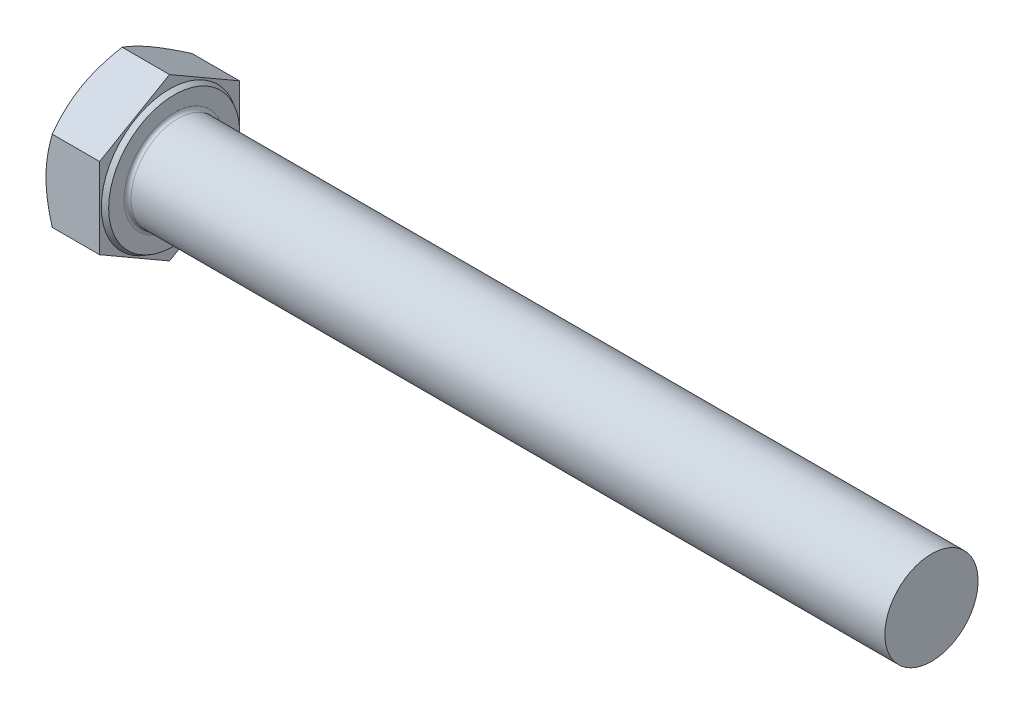
ISO-10303-21;
HEADER;
FILE_DESCRIPTION(('STEP AP214'),'2;1');
FILE_NAME('part.step','',(''),(''),'','','');
FILE_SCHEMA(('AUTOMOTIVE_DESIGN { 1 0 10303 214 1 1 1 1 }'));
ENDSEC;
DATA;
#1=APPLICATION_CONTEXT('core data for automotive mechanical design processes');
#2=APPLICATION_PROTOCOL_DEFINITION('international standard','automotive_design',2000,#1);
#3=PRODUCT_CONTEXT('',#1,'mechanical');
#4=PRODUCT('Part','Part','',(#3));
#5=PRODUCT_RELATED_PRODUCT_CATEGORY('part','',(#4));
#6=PRODUCT_DEFINITION_FORMATION('','',#4);
#7=PRODUCT_DEFINITION_CONTEXT('part definition',#1,'design');
#8=PRODUCT_DEFINITION('design','',#6,#7);
#9=PRODUCT_DEFINITION_SHAPE('','',#8);
#10=(LENGTH_UNIT() NAMED_UNIT(*) SI_UNIT(.MILLI.,.METRE.));
#11=(NAMED_UNIT(*) PLANE_ANGLE_UNIT() SI_UNIT($,.RADIAN.));
#12=(NAMED_UNIT(*) SI_UNIT($,.STERADIAN.) SOLID_ANGLE_UNIT());
#13=UNCERTAINTY_MEASURE_WITH_UNIT(LENGTH_MEASURE(1.E-05),#10,'distance_accuracy_value','');
#14=(GEOMETRIC_REPRESENTATION_CONTEXT(3) GLOBAL_UNCERTAINTY_ASSIGNED_CONTEXT((#13)) GLOBAL_UNIT_ASSIGNED_CONTEXT((#10,
#11,#12)) REPRESENTATION_CONTEXT('',''));
#15=CARTESIAN_POINT('',(0.,0.,0.));
#16=DIRECTION('',(0.,0.,1.));
#17=DIRECTION('',(1.,0.,0.));
#18=AXIS2_PLACEMENT_3D('',#15,#16,#17);
#19=CARTESIAN_POINT('',(10.,6.9282032302755,-12.));
#20=DIRECTION('',(0.,-0.866025403784438,0.500000000000001));
#21=DIRECTION('',(0.,-0.500000000000001,-0.866025403784438));
#22=AXIS2_PLACEMENT_3D('',#19,#20,#21);
#23=PLANE('',#22);
#24=DIRECTION('',(0.,0.500000000000001,0.866025403784438));
#25=VECTOR('',#24,1.);
#26=CARTESIAN_POINT('',(9.2,6.9282032302755,-12.));
#27=LINE('',#26,#25);
#28=CARTESIAN_POINT('',(9.2,6.92820323027553,-12.));
#29=VERTEX_POINT('',#28);
#30=CARTESIAN_POINT('',(9.2,13.856406460551,0.));
#31=VERTEX_POINT('',#30);
#32=EDGE_CURVE('E117',#29,#31,#27,.T.);
#33=ORIENTED_EDGE('',*,*,#32,.F.);
#34=DIRECTION('',(-1.,0.,0.));
#35=VECTOR('',#34,1.);
#36=CARTESIAN_POINT('',(10.,6.9282032302755,-12.));
#37=LINE('',#36,#35);
#38=CARTESIAN_POINT('',(1.07179676972448,6.9282032302755,-12.));
#39=VERTEX_POINT('',#38);
#40=EDGE_CURVE('E265',#29,#39,#37,.T.);
#41=ORIENTED_EDGE('',*,*,#40,.T.);
#42=CARTESIAN_POINT('',(1.07186343722448,13.8565219306049,0.000199999999999553));
#43=CARTESIAN_POINT('',(0.983949632185867,13.7042251307133,-0.263585795242262));
#44=CARTESIAN_POINT('',(0.900025997556673,13.5513604901482,-0.5283551193818));
#45=CARTESIAN_POINT('',(0.741266218872847,13.244405350712,-1.06001701652966));
#46=CARTESIAN_POINT('',(0.666433063673588,13.0903144663124,-1.32691025729307));
#47=CARTESIAN_POINT('',(0.457017539854156,12.6255589607763,-2.13189040597901));
#48=CARTESIAN_POINT('',(0.337903236722854,12.3130596590925,-2.6731550738251));
#49=CARTESIAN_POINT('',(0.198231061003147,11.8454187840152,-3.483132829155));
#50=CARTESIAN_POINT('',(0.158443797040446,11.6916742921315,-3.74942610048137));
#51=CARTESIAN_POINT('',(0.0917233692170917,11.3834734611381,-4.28324559869684));
#52=CARTESIAN_POINT('',(0.064790452767776,11.2290171083848,-4.55077184921738));
#53=CARTESIAN_POINT('',(0.0244685919169266,10.9198468953819,-5.08627036632535));
#54=CARTESIAN_POINT('',(0.0110635528823191,10.7651335610083,-5.35424172206873));
#55=CARTESIAN_POINT('',(-0.00191690624283182,10.4555635369292,-5.89043273227404));
#56=CARTESIAN_POINT('',(-0.00149275363726502,10.3007068518009,-6.15865237880804));
#57=CARTESIAN_POINT('',(0.0122200193427726,10.011202064883,-6.6600893787841));
#58=CARTESIAN_POINT('',(0.0238359825785306,9.87653331649855,-6.89334249317776));
#59=CARTESIAN_POINT('',(0.0573080088723786,9.60750555673725,-7.35931224173077));
#60=CARTESIAN_POINT('',(0.0791647962662195,9.47314656794543,-7.59202883677177));
#61=CARTESIAN_POINT('',(0.132737416542911,9.20481134519089,-8.05679907604294));
#62=CARTESIAN_POINT('',(0.164461392492925,9.07083551994084,-8.288852012362));
#63=CARTESIAN_POINT('',(0.237211775670441,8.80351197901489,-8.75186996730498));
#64=CARTESIAN_POINT('',(0.278238815183198,8.67016430666066,-8.98283491089354));
#65=CARTESIAN_POINT('',(0.416311653281803,8.2653799638421,-9.68394195876367));
#66=CARTESIAN_POINT('',(0.527124888339326,7.99511549730955,-10.1520537462785));
#67=CARTESIAN_POINT('',(0.778625766937884,7.45861659251288,-11.0812971075914));
#68=CARTESIAN_POINT('',(0.919254342659384,7.19237528499142,-11.5424405792922));
#69=CARTESIAN_POINT('',(1.07186343722448,6.92808776022166,-12.0002));
#70=B_SPLINE_CURVE_WITH_KNOTS('',3,(#42,#43,#44,#45,#46,#47,#48,#49,#50,#51,#52,#53,#54,#55,#56,
#57,#58,#59,#60,#61,#62,#63,#64,#65,#66,#67,#68,#69),.UNSPECIFIED.,.F.,.F.,(4,2,2,2,2,2,2,2,2,2,
2,2,2,4),(0.,0.951004872251246,1.90232158356438,3.80900466161369,4.7389455141357,
5.6689042647761,6.59775529889866,7.52657763276931,8.33514643820579,9.1437724425275,
9.95306755799766,10.7624176939264,12.4167102786892,14.0677556316691),.UNSPECIFIED.);
#71=CARTESIAN_POINT('',(0.,10.3923048454133,-6.00000000000001));
#72=VERTEX_POINT('',#71);
#73=EDGE_CURVE('E173',#72,#39,#70,.T.);
#74=ORIENTED_EDGE('',*,*,#73,.F.);
#75=CARTESIAN_POINT('',(1.07179676972449,13.856406460551,0.));
#76=VERTEX_POINT('',#75);
#77=EDGE_CURVE('E63',#76,#72,#70,.T.);
#78=ORIENTED_EDGE('',*,*,#77,.F.);
#79=DIRECTION('',(-1.,0.,0.));
#80=VECTOR('',#79,1.);
#81=CARTESIAN_POINT('',(10.,13.856406460551,0.));
#82=LINE('',#81,#80);
#83=EDGE_CURVE('E136',#31,#76,#82,.T.);
#84=ORIENTED_EDGE('',*,*,#83,.F.);
#85=EDGE_LOOP('',(#33,#41,#74,#78,#84));
#86=FACE_BOUND('',#85,.T.);
#87=ADVANCED_FACE('F40',(#86),#23,.F.);
#88=CARTESIAN_POINT('',(10.,13.856406460551,0.));
#89=DIRECTION('',(0.,-0.866025403784438,-0.500000000000001));
#90=DIRECTION('',(0.,0.500000000000001,-0.866025403784438));
#91=AXIS2_PLACEMENT_3D('',#88,#89,#90);
#92=PLANE('',#91);
#93=DIRECTION('',(0.,-0.500000000000001,0.866025403784438));
#94=VECTOR('',#93,1.);
#95=CARTESIAN_POINT('',(9.2,13.856406460551,0.));
#96=LINE('',#95,#94);
#97=CARTESIAN_POINT('',(9.2,6.92820323027553,12.));
#98=VERTEX_POINT('',#97);
#99=EDGE_CURVE('E111',#31,#98,#96,.T.);
#100=ORIENTED_EDGE('',*,*,#99,.F.);
#101=ORIENTED_EDGE('',*,*,#83,.T.);
#102=CARTESIAN_POINT('',(1.07186343722448,6.92808776022167,12.0002));
#103=CARTESIAN_POINT('',(0.983949632185859,7.08038456011319,11.7364142047577));
#104=CARTESIAN_POINT('',(0.900025997556666,7.2332492006783,11.4716448806182));
#105=CARTESIAN_POINT('',(0.74126621887284,7.54020434011449,10.9399829834703));
#106=CARTESIAN_POINT('',(0.666433063673582,7.69429522451413,10.6730897427069));
#107=CARTESIAN_POINT('',(0.457017539854152,8.15905073005027,9.86810959402099));
#108=CARTESIAN_POINT('',(0.33790323672285,8.47155003173404,9.3268449261749));
#109=CARTESIAN_POINT('',(0.198231061003145,8.93919090681137,8.51686717084501));
#110=CARTESIAN_POINT('',(0.158443797040445,9.09293539869504,8.25057389951863));
#111=CARTESIAN_POINT('',(0.0917233692170918,9.40113622968841,7.71675440130317));
#112=CARTESIAN_POINT('',(0.0647904527677764,9.55559258244173,7.44922815078262));
#113=CARTESIAN_POINT('',(0.0244685919169272,9.86476279544467,6.91372963367465));
#114=CARTESIAN_POINT('',(0.0110635528823195,10.0194761298182,6.64575827793128));
#115=CARTESIAN_POINT('',(-0.00191690624283124,10.3290461538973,6.10956726772597));
#116=CARTESIAN_POINT('',(-0.00149275363726407,10.4839028390257,5.84134762119197));
#117=CARTESIAN_POINT('',(0.0122200193427746,10.7734076259435,5.3399106212159));
#118=CARTESIAN_POINT('',(0.0238359825785332,10.908076374328,5.10665750682225));
#119=CARTESIAN_POINT('',(0.0573080088723814,11.1771041340893,4.64068775826924));
#120=CARTESIAN_POINT('',(0.0791647962662217,11.3114631228811,4.40797116322823));
#121=CARTESIAN_POINT('',(0.132737416542914,11.5797983456356,3.94320092395706));
#122=CARTESIAN_POINT('',(0.164461392492929,11.7137741708857,3.711147987638));
#123=CARTESIAN_POINT('',(0.237211775670446,11.9810977118116,3.24813003269502));
#124=CARTESIAN_POINT('',(0.278238815183203,12.1144453841659,3.01716508910646));
#125=CARTESIAN_POINT('',(0.416311653281808,12.5192297269844,2.31605804123633));
#126=CARTESIAN_POINT('',(0.527124888339332,12.789494193517,1.84794625372147));
#127=CARTESIAN_POINT('',(0.778625766937891,13.3259930983136,0.918702892408579));
#128=CARTESIAN_POINT('',(0.919254342659392,13.5922344058351,0.457559420707846));
#129=CARTESIAN_POINT('',(1.07186343722448,13.8565219306049,-0.000200000000000272));
#130=B_SPLINE_CURVE_WITH_KNOTS('',3,(#102,#103,#104,#105,#106,#107,#108,#109,#110,#111,#112,
#113,#114,#115,#116,#117,#118,#119,#120,#121,#122,#123,#124,#125,#126,#127,#128,#129),
.UNSPECIFIED.,.F.,.F.,(4,2,2,2,2,2,2,2,2,2,2,2,2,4),(0.,0.951004872251244,1.90232158356437,
3.80900466161369,4.7389455141357,5.66890426477609,6.59775529889865,7.5265776327693,
8.33514643820579,9.14377244252749,9.95306755799765,10.7624176939264,12.4167102786892,
14.0677556316691),.UNSPECIFIED.);
#131=CARTESIAN_POINT('',(0.,10.3923048454133,6.00000000000001));
#132=VERTEX_POINT('',#131);
#133=EDGE_CURVE('E221',#132,#76,#130,.T.);
#134=ORIENTED_EDGE('',*,*,#133,.F.);
#135=CARTESIAN_POINT('',(1.07179676972448,6.9282032302755,12.));
#136=VERTEX_POINT('',#135);
#137=EDGE_CURVE('E135',#136,#132,#130,.T.);
#138=ORIENTED_EDGE('',*,*,#137,.F.);
#139=DIRECTION('',(-1.,0.,0.));
#140=VECTOR('',#139,1.);
#141=CARTESIAN_POINT('',(10.,6.9282032302755,12.));
#142=LINE('',#141,#140);
#143=EDGE_CURVE('E126',#98,#136,#142,.T.);
#144=ORIENTED_EDGE('',*,*,#143,.F.);
#145=EDGE_LOOP('',(#100,#101,#134,#138,#144));
#146=FACE_BOUND('',#145,.T.);
#147=ADVANCED_FACE('F133',(#146),#92,.F.);
#148=CARTESIAN_POINT('',(10.,6.9282032302755,12.));
#149=DIRECTION('',(0.,0.,-1.));
#150=DIRECTION('',(-1.,0.,0.));
#151=AXIS2_PLACEMENT_3D('',#148,#149,#150);
#152=PLANE('',#151);
#153=DIRECTION('',(0.,-1.,0.));
#154=VECTOR('',#153,1.);
#155=CARTESIAN_POINT('',(9.2,6.9282032302755,12.));
#156=LINE('',#155,#154);
#157=CARTESIAN_POINT('',(9.2,-6.92820323027552,12.));
#158=VERTEX_POINT('',#157);
#159=EDGE_CURVE('E114',#98,#158,#156,.T.);
#160=ORIENTED_EDGE('',*,*,#159,.F.);
#161=ORIENTED_EDGE('',*,*,#143,.T.);
#162=CARTESIAN_POINT('',(5.9379652249916,-18.7780422876809,12.));
#163=CARTESIAN_POINT('',(5.81013580153171,-18.5152821742341,12.));
#164=CARTESIAN_POINT('',(5.68293119845564,-18.2522182359297,12.));
#165=CARTESIAN_POINT('',(5.42991281410037,-17.7254193681017,12.));
#166=CARTESIAN_POINT('',(5.30409904630056,-17.4616844321055,12.));
#167=CARTESIAN_POINT('',(4.92892368290875,-16.6693101743882,12.));
#168=CARTESIAN_POINT('',(4.68186469152994,-16.1395765656331,12.));
#169=CARTESIAN_POINT('',(4.19405479952982,-15.0738169190078,12.));
#170=CARTESIAN_POINT('',(3.95334413341026,-14.5377724221017,12.));
#171=CARTESIAN_POINT('',(3.48154718674623,-13.461479060208,12.));
#172=CARTESIAN_POINT('',(3.25046046260965,-12.9212303903669,12.));
#173=CARTESIAN_POINT('',(2.79294900667128,-11.8175688689819,12.));
#174=CARTESIAN_POINT('',(2.56693655895501,-11.2539842320577,12.));
#175=CARTESIAN_POINT('',(2.13161283273163,-10.1202797331247,12.));
#176=CARTESIAN_POINT('',(1.92230340506571,-9.55015915485906,12.));
#177=CARTESIAN_POINT('',(1.52576124918553,-8.40350794466347,12.));
#178=CARTESIAN_POINT('',(1.33848523718245,-7.82699240007888,12.));
#179=CARTESIAN_POINT('',(0.991896700180059,-6.66563869600162,12.));
#180=CARTESIAN_POINT('',(0.832575542892165,-6.08080316618919,12.));
#181=CARTESIAN_POINT('',(0.620681197025571,-5.19882791551971,12.));
#182=CARTESIAN_POINT('',(0.554713150855291,-4.90488790342147,12.));
#183=CARTESIAN_POINT('',(0.432574422995982,-4.31496880701143,12.));
#184=CARTESIAN_POINT('',(0.376403548449441,-4.01898976295725,12.));
#185=CARTESIAN_POINT('',(0.27484004416511,-3.42518449183526,12.));
#186=CARTESIAN_POINT('',(0.229447213467065,-3.12735829931441,12.));
#187=CARTESIAN_POINT('',(0.150338666864214,-2.53016033534833,12.));
#188=CARTESIAN_POINT('',(0.116622484244829,-2.23078862616279,12.));
#189=CARTESIAN_POINT('',(0.0619693201283227,-1.63489952034464,12.));
#190=CARTESIAN_POINT('',(0.0408679219512437,-1.33839729705375,12.));
#191=CARTESIAN_POINT('',(0.0112310519021946,-0.744766224338129,12.));
#192=CARTESIAN_POINT('',(0.00269536679662733,-0.447637385632426,12.));
#193=CARTESIAN_POINT('',(-0.00160621157202336,0.146715096942924,12.));
#194=CARTESIAN_POINT('',(0.00262788821472192,0.443938740760884,12.));
#195=CARTESIAN_POINT('',(0.0237602868313374,1.03793867900076,12.));
#196=CARTESIAN_POINT('',(0.0406591751133799,1.33471495195666,12.));
#197=CARTESIAN_POINT('',(0.0957363037225936,2.04293812544911,12.));
#198=CARTESIAN_POINT('',(0.139644388869434,2.45394931182504,12.));
#199=CARTESIAN_POINT('',(0.249393763135934,3.27301119833394,12.));
#200=CARTESIAN_POINT('',(0.315237895547363,3.68106150767658,12.));
#201=CARTESIAN_POINT('',(0.542190666924391,4.90025554060104,12.));
#202=CARTESIAN_POINT('',(0.732681274216203,5.70600726238708,12.));
#203=CARTESIAN_POINT('',(1.06415793334627,6.91101760118603,12.));
#204=CARTESIAN_POINT('',(1.18384338751807,7.31649624625233,12.));
#205=CARTESIAN_POINT('',(1.43593551476422,8.1235184018115,12.));
#206=CARTESIAN_POINT('',(1.56834227450981,8.52506188547325,12.));
#207=CARTESIAN_POINT('',(1.8437286581276,9.32433402651663,12.));
#208=CARTESIAN_POINT('',(1.9867050037192,9.72206382387893,12.));
#209=CARTESIAN_POINT('',(2.28151949374364,10.5142091061849,12.));
#210=CARTESIAN_POINT('',(2.4333575167401,10.908624636461,12.));
#211=CARTESIAN_POINT('',(2.81137815071346,11.8636440545741,12.));
#212=CARTESIAN_POINT('',(3.04143185567875,12.4227131308577,12.));
#213=CARTESIAN_POINT('',(3.51333410611205,13.5358669332653,12.));
#214=CARTESIAN_POINT('',(3.75518348678292,14.0899513031431,12.));
#215=CARTESIAN_POINT('',(4.24823475653156,15.1941025186566,12.));
#216=CARTESIAN_POINT('',(4.49943904043688,15.7441682918315,12.));
#217=CARTESIAN_POINT('',(5.00924552887371,16.8408349536019,12.));
#218=CARTESIAN_POINT('',(5.26784754956297,17.3874359278899,12.));
#219=CARTESIAN_POINT('',(5.7913387992848,18.4784293923002,12.));
#220=CARTESIAN_POINT('',(6.0562352746522,19.0228183989982,12.));
#221=CARTESIAN_POINT('',(6.59090796254076,20.1091945794083,12.));
#222=CARTESIAN_POINT('',(6.86068419945744,20.6511817410959,12.));
#223=CARTESIAN_POINT('',(7.40421496208664,21.7330545936328,12.));
#224=CARTESIAN_POINT('',(7.67796889125698,22.2729405845111,12.));
#225=CARTESIAN_POINT('',(8.22882461462082,23.3510028742049,12.));
#226=CARTESIAN_POINT('',(8.50592642242827,23.8891791660568,12.));
#227=CARTESIAN_POINT('',(9.29226596146123,25.4066579940567,12.));
#228=CARTESIAN_POINT('',(9.80475659623532,26.3842748096138,12.));
#229=CARTESIAN_POINT('',(10.8366490575024,28.3358962609434,12.));
#230=CARTESIAN_POINT('',(11.3560511647271,29.3099007479222,12.));
#231=CARTESIAN_POINT('',(12.3986980712295,31.2524398572292,12.));
#232=CARTESIAN_POINT('',(12.9219285874182,32.2209821512087,12.));
#233=CARTESIAN_POINT('',(13.709817261168,33.6721037842397,12.));
#234=CARTESIAN_POINT('',(13.9729461083086,34.1555146940213,12.));
#235=CARTESIAN_POINT('',(14.5001155834576,35.1218381868036,12.));
#236=CARTESIAN_POINT('',(14.7641562100751,35.6047507705631,12.));
#237=CARTESIAN_POINT('',(15.0285993289473,36.0874429112689,12.));
#238=B_SPLINE_CURVE_WITH_KNOTS('',3,(#162,#163,#164,#165,#166,#167,#168,#169,#170,#171,#172,
#173,#174,#175,#176,#177,#178,#179,#180,#181,#182,#183,#184,#185,#186,#187,#188,#189,#190,#191,
#192,#193,#194,#195,#196,#197,#198,#199,#200,#201,#202,#203,#204,#205,#206,#207,#208,#209,#210,
#211,#212,#213,#214,#215,#216,#217,#218,#219,#220,#221,#222,#223,#224,#225,#226,#227,#228,#229,
#230,#231,#232,#233,#234,#235,#236,#237),.UNSPECIFIED.,.F.,.F.,(4,2,2,2,2,2,2,2,2,2,2,2,2,2,2,2,
2,2,2,2,2,2,2,2,2,2,2,2,2,2,2,2,2,2,2,2,2,4),(0.,0.876610778943413,1.75323004620523,
3.50671945197807,5.26947518067905,7.03214956933034,8.85359042595666,10.6752328347611,
12.4932347351832,14.3106742559303,15.2142921518806,16.117892258087,17.0214755150421,
17.9250226516858,18.816520871687,19.7080039632539,20.5994865696161,21.4910106704728,
22.7303633484055,23.9698767304575,26.4502079763428,27.7184187234137,28.9866381115161,
30.2544657836991,31.5222760862275,33.3357454112635,35.1493433274816,36.9634087547281,
38.7774291394606,40.5936500751824,42.4098800933003,44.2258404831105,46.0418082599001,
49.3531754129826,52.664677481008,55.9671781132062,57.6183303465534,59.2694800621134),.UNSPECIFIED.);
#239=CARTESIAN_POINT('',(0.,0.,12.));
#240=VERTEX_POINT('',#239);
#241=EDGE_CURVE('E226',#240,#136,#238,.T.);
#242=ORIENTED_EDGE('',*,*,#241,.F.);
#243=CARTESIAN_POINT('',(1.07179676972449,-6.92820323027552,12.));
#244=VERTEX_POINT('',#243);
#245=EDGE_CURVE('E232',#244,#240,#238,.T.);
#246=ORIENTED_EDGE('',*,*,#245,.F.);
#247=DIRECTION('',(-1.,0.,0.));
#248=VECTOR('',#247,1.);
#249=CARTESIAN_POINT('',(10.,-6.92820323027552,12.));
#250=LINE('',#249,#248);
#251=EDGE_CURVE('E129',#158,#244,#250,.T.);
#252=ORIENTED_EDGE('',*,*,#251,.F.);
#253=EDGE_LOOP('',(#160,#161,#242,#246,#252));
#254=FACE_BOUND('',#253,.T.);
#255=ADVANCED_FACE('F124',(#254),#152,.F.);
#256=CARTESIAN_POINT('',(10.,-13.856406460551,0.));
#257=DIRECTION('',(0.,0.866025403784438,-0.500000000000001));
#258=DIRECTION('',(0.,0.500000000000001,0.866025403784438));
#259=AXIS2_PLACEMENT_3D('',#256,#257,#258);
#260=PLANE('',#259);
#261=DIRECTION('',(0.,-0.500000000000001,-0.866025403784438));
#262=VECTOR('',#261,1.);
#263=CARTESIAN_POINT('',(9.2,-13.856406460551,0.));
#264=LINE('',#263,#262);
#265=CARTESIAN_POINT('',(9.2,-13.856406460551,0.));
#266=VERTEX_POINT('',#265);
#267=EDGE_CURVE('E130',#158,#266,#264,.T.);
#268=ORIENTED_EDGE('',*,*,#267,.F.);
#269=ORIENTED_EDGE('',*,*,#251,.T.);
#270=CARTESIAN_POINT('',(1.0718634372245,-13.8565219306049,-0.000200000000000002));
#271=CARTESIAN_POINT('',(0.983949632185878,-13.7042251307134,0.263585795242263));
#272=CARTESIAN_POINT('',(0.900025997556684,-13.5513604901482,0.528355119381801));
#273=CARTESIAN_POINT('',(0.741266218872858,-13.2444053507121,1.06001701652966));
#274=CARTESIAN_POINT('',(0.6664330636736,-13.0903144663124,1.32691025729307));
#275=CARTESIAN_POINT('',(0.457017539854168,-12.6255589607763,2.13189040597901));
#276=CARTESIAN_POINT('',(0.337903236722866,-12.3130596590925,2.6731550738251));
#277=CARTESIAN_POINT('',(0.198231061003159,-11.8454187840152,3.483132829155));
#278=CARTESIAN_POINT('',(0.158443797040458,-11.6916742921315,3.74942610048138));
#279=CARTESIAN_POINT('',(0.0917233692171037,-11.3834734611381,4.28324559869685));
#280=CARTESIAN_POINT('',(0.0647904527677882,-11.2290171083848,4.55077184921739));
#281=CARTESIAN_POINT('',(0.0244685919169384,-10.9198468953819,5.08627036632536));
#282=CARTESIAN_POINT('',(0.0110635528823302,-10.7651335610083,5.35424172206874));
#283=CARTESIAN_POINT('',(-0.00191690624282097,-10.4555635369292,5.89043273227405));
#284=CARTESIAN_POINT('',(-0.00149275363725383,-10.3007068518009,6.15865237880805));
#285=CARTESIAN_POINT('',(0.0122200193427844,-10.0112020648831,6.66008937878412));
#286=CARTESIAN_POINT('',(0.0238359825785426,-9.87653331649857,6.89334249317777));
#287=CARTESIAN_POINT('',(0.0573080088723901,-9.60750555673727,7.35931224173078));
#288=CARTESIAN_POINT('',(0.0791647962662302,-9.47314656794545,7.59202883677178));
#289=CARTESIAN_POINT('',(0.132737416542921,-9.20481134519091,8.05679907604295));
#290=CARTESIAN_POINT('',(0.164461392492935,-9.07083551994086,8.28885201236201));
#291=CARTESIAN_POINT('',(0.237211775670452,-8.8035119790149,8.75186996730499));
#292=CARTESIAN_POINT('',(0.278238815183209,-8.67016430666068,8.98283491089355));
#293=CARTESIAN_POINT('',(0.416311653281814,-8.26537996384211,9.68394195876367));
#294=CARTESIAN_POINT('',(0.527124888339336,-7.99511549730957,10.1520537462785));
#295=CARTESIAN_POINT('',(0.778625766937892,-7.4586165925129,11.0812971075914));
#296=CARTESIAN_POINT('',(0.91925434265939,-7.19237528499145,11.5424405792922));
#297=CARTESIAN_POINT('',(1.07186343722448,-6.92808776022168,12.0002));
#298=B_SPLINE_CURVE_WITH_KNOTS('',3,(#270,#271,#272,#273,#274,#275,#276,#277,#278,#279,#280,
#281,#282,#283,#284,#285,#286,#287,#288,#289,#290,#291,#292,#293,#294,#295,#296,#297),
.UNSPECIFIED.,.F.,.F.,(4,2,2,2,2,2,2,2,2,2,2,2,2,4),(0.,0.951004872251247,1.90232158356438,
3.80900466161369,4.73894551413571,5.66890426477611,6.59775529889867,7.52657763276932,
8.3351464382058,9.14377244252751,9.95306755799767,10.7624176939264,12.4167102786892,
14.0677556316691),.UNSPECIFIED.);
#299=CARTESIAN_POINT('',(0.,-10.3923048454133,6.00000000000001));
#300=VERTEX_POINT('',#299);
#301=EDGE_CURVE('E233',#300,#244,#298,.T.);
#302=ORIENTED_EDGE('',*,*,#301,.F.);
#303=CARTESIAN_POINT('',(1.0717967697245,-13.856406460551,0.));
#304=VERTEX_POINT('',#303);
#305=EDGE_CURVE('E189',#304,#300,#298,.T.);
#306=ORIENTED_EDGE('',*,*,#305,.F.);
#307=DIRECTION('',(-1.,0.,0.));
#308=VECTOR('',#307,1.);
#309=CARTESIAN_POINT('',(10.,-13.856406460551,0.));
#310=LINE('',#309,#308);
#311=EDGE_CURVE('E140',#266,#304,#310,.T.);
#312=ORIENTED_EDGE('',*,*,#311,.F.);
#313=EDGE_LOOP('',(#268,#269,#302,#306,#312));
#314=FACE_BOUND('',#313,.T.);
#315=ADVANCED_FACE('F238',(#314),#260,.F.);
#316=CARTESIAN_POINT('',(10.,-6.92820323027553,-12.));
#317=DIRECTION('',(0.,0.866025403784438,0.500000000000001));
#318=DIRECTION('',(0.,-0.500000000000001,0.866025403784438));
#319=AXIS2_PLACEMENT_3D('',#316,#317,#318);
#320=PLANE('',#319);
#321=DIRECTION('',(0.,0.500000000000001,-0.866025403784438));
#322=VECTOR('',#321,1.);
#323=CARTESIAN_POINT('',(9.2,-6.92820323027553,-12.));
#324=LINE('',#323,#322);
#325=CARTESIAN_POINT('',(9.2,-6.92820323027553,-12.));
#326=VERTEX_POINT('',#325);
#327=EDGE_CURVE('E55',#266,#326,#324,.T.);
#328=ORIENTED_EDGE('',*,*,#327,.F.);
#329=ORIENTED_EDGE('',*,*,#311,.T.);
#330=CARTESIAN_POINT('',(1.07186343722449,-6.92808776022169,-12.0002));
#331=CARTESIAN_POINT('',(0.983949632185869,-7.08038456011321,-11.7364142047577));
#332=CARTESIAN_POINT('',(0.900025997556675,-7.23324920067833,-11.4716448806182));
#333=CARTESIAN_POINT('',(0.74126621887285,-7.54020434011451,-10.9399829834703));
#334=CARTESIAN_POINT('',(0.666433063673592,-7.69429522451416,-10.6730897427069));
#335=CARTESIAN_POINT('',(0.457017539854161,-8.15905073005029,-9.86810959402099));
#336=CARTESIAN_POINT('',(0.337903236722859,-8.47155003173407,-9.3268449261749));
#337=CARTESIAN_POINT('',(0.198231061003155,-8.93919090681139,-8.516867170845));
#338=CARTESIAN_POINT('',(0.158443797040455,-9.09293539869506,-8.25057389951863));
#339=CARTESIAN_POINT('',(0.0917233692171019,-9.40113622968843,-7.71675440130316));
#340=CARTESIAN_POINT('',(0.0647904527677862,-9.55559258244176,-7.44922815078262));
#341=CARTESIAN_POINT('',(0.0244685919169374,-9.86476279544469,-6.91372963367465));
#342=CARTESIAN_POINT('',(0.0110635528823304,-10.0194761298182,-6.64575827793127));
#343=CARTESIAN_POINT('',(-0.00191690624281961,-10.3290461538973,-6.10956726772596));
#344=CARTESIAN_POINT('',(-0.00149275363725249,-10.4839028390257,-5.84134762119196));
#345=CARTESIAN_POINT('',(0.012220019342787,-10.7734076259435,-5.33991062121589));
#346=CARTESIAN_POINT('',(0.0238359825785463,-10.908076374328,-5.10665750682224));
#347=CARTESIAN_POINT('',(0.0573080088723954,-11.1771041340893,-4.64068775826923));
#348=CARTESIAN_POINT('',(0.0791647962662359,-11.3114631228811,-4.40797116322823));
#349=CARTESIAN_POINT('',(0.132737416542928,-11.5797983456357,-3.94320092395705));
#350=CARTESIAN_POINT('',(0.164461392492942,-11.7137741708857,-3.71114798763799));
#351=CARTESIAN_POINT('',(0.237211775670459,-11.9810977118117,-3.24813003269502));
#352=CARTESIAN_POINT('',(0.278238815183216,-12.1144453841659,-3.01716508910646));
#353=CARTESIAN_POINT('',(0.416311653281823,-12.5192297269845,-2.31605804123633));
#354=CARTESIAN_POINT('',(0.527124888339346,-12.789494193517,-1.84794625372147));
#355=CARTESIAN_POINT('',(0.778625766937904,-13.3259930983137,-0.918702892408577));
#356=CARTESIAN_POINT('',(0.919254342659403,-13.5922344058351,-0.457559420707845));
#357=CARTESIAN_POINT('',(1.0718634372245,-13.8565219306049,0.000199999999999682));
#358=B_SPLINE_CURVE_WITH_KNOTS('',3,(#330,#331,#332,#333,#334,#335,#336,#337,#338,#339,#340,
#341,#342,#343,#344,#345,#346,#347,#348,#349,#350,#351,#352,#353,#354,#355,#356,#357),
.UNSPECIFIED.,.F.,.F.,(4,2,2,2,2,2,2,2,2,2,2,2,2,4),(0.,0.951004872251245,1.90232158356438,
3.80900466161369,4.73894551413571,5.6689042647761,6.59775529889866,7.52657763276931,
8.3351464382058,9.1437724425275,9.95306755799766,10.7624176939264,12.4167102786892,
14.0677556316691),.UNSPECIFIED.);
#359=CARTESIAN_POINT('',(0.,-10.3923048454133,-6.00000000000001));
#360=VERTEX_POINT('',#359);
#361=EDGE_CURVE('E284',#360,#304,#358,.T.);
#362=ORIENTED_EDGE('',*,*,#361,.F.);
#363=CARTESIAN_POINT('',(1.07179676972449,-6.92820323027553,-12.));
#364=VERTEX_POINT('',#363);
#365=EDGE_CURVE('E182',#364,#360,#358,.T.);
#366=ORIENTED_EDGE('',*,*,#365,.F.);
#367=DIRECTION('',(-1.,0.,0.));
#368=VECTOR('',#367,1.);
#369=CARTESIAN_POINT('',(10.,-6.92820323027553,-12.));
#370=LINE('',#369,#368);
#371=EDGE_CURVE('E266',#326,#364,#370,.T.);
#372=ORIENTED_EDGE('',*,*,#371,.F.);
#373=EDGE_LOOP('',(#328,#329,#362,#366,#372));
#374=FACE_BOUND('',#373,.T.);
#375=ADVANCED_FACE('F241',(#374),#320,.F.);
#376=CARTESIAN_POINT('',(10.,6.9282032302755,-12.));
#377=DIRECTION('',(0.,0.,1.));
#378=DIRECTION('',(0.,-1.,0.));
#379=AXIS2_PLACEMENT_3D('',#376,#377,#378);
#380=PLANE('',#379);
#381=DIRECTION('',(0.,1.,0.));
#382=VECTOR('',#381,1.);
#383=CARTESIAN_POINT('',(9.2,6.9282032302755,-12.));
#384=LINE('',#383,#382);
#385=EDGE_CURVE('E148',#326,#29,#384,.T.);
#386=ORIENTED_EDGE('',*,*,#385,.F.);
#387=ORIENTED_EDGE('',*,*,#371,.T.);
#388=CARTESIAN_POINT('',(5.93796522688054,-18.7780422915637,-12.));
#389=CARTESIAN_POINT('',(5.81013580338123,-18.5152821780516,-12.));
#390=CARTESIAN_POINT('',(5.68293120026577,-18.2522182396819,-12.));
#391=CARTESIAN_POINT('',(5.42991281583177,-17.7254193717233,-12.));
#392=CARTESIAN_POINT('',(5.30409904799263,-17.4616844356616,-12.));
#393=CARTESIAN_POINT('',(4.92892368448296,-16.6693101777481,-12.));
#394=CARTESIAN_POINT('',(4.68186469302576,-16.139576568862,-12.));
#395=CARTESIAN_POINT('',(4.1940548008688,-15.0738169219726,-12.));
#396=CARTESIAN_POINT('',(3.95334413467082,-14.5377724249334,-12.));
#397=CARTESIAN_POINT('',(3.48154718785123,-13.4614790627728,-12.));
#398=CARTESIAN_POINT('',(3.25046046363751,-12.9212303927977,-12.));
#399=CARTESIAN_POINT('',(2.79294900754263,-11.8175688711343,-12.));
#400=CARTESIAN_POINT('',(2.56693655974715,-11.2539842340656,-12.));
#401=CARTESIAN_POINT('',(2.13161283336958,-10.1202797348412,-12.));
#402=CARTESIAN_POINT('',(1.92230340562868,-9.5501591564287,-12.));
#403=CARTESIAN_POINT('',(1.52576124960573,-8.40350794593668,-12.));
#404=CARTESIAN_POINT('',(1.33848523753484,-7.82699240120254,-12.));
#405=CARTESIAN_POINT('',(0.991896700407879,-6.66563869682204,-12.));
#406=CARTESIAN_POINT('',(0.83257554306323,-6.08080316685593,-12.));
#407=CARTESIAN_POINT('',(0.620681197115229,-5.19882791591539,-12.));
#408=CARTESIAN_POINT('',(0.554713150915105,-4.90488790370127,-12.));
#409=CARTESIAN_POINT('',(0.432574423003703,-4.3149688070578,-12.));
#410=CARTESIAN_POINT('',(0.376403548434913,-4.01898976288609,-12.));
#411=CARTESIAN_POINT('',(0.274840044114871,-3.42518449152774,-12.));
#412=CARTESIAN_POINT('',(0.229447213403359,-3.12735829888806,-12.));
#413=CARTESIAN_POINT('',(0.150338666783352,-2.53016033468332,-12.));
#414=CARTESIAN_POINT('',(0.116622484160278,-2.23078862537795,-12.));
#415=CARTESIAN_POINT('',(0.0619693200469881,-1.63489951932263,-12.));
#416=CARTESIAN_POINT('',(0.0408679218766202,-1.33839729591442,-12.));
#417=CARTESIAN_POINT('',(0.0112310518513546,-0.744766222964399,-12.));
#418=CARTESIAN_POINT('',(0.0026953667628598,-0.447637384141609,-12.));
#419=CARTESIAN_POINT('',(-0.00160621156152525,0.146715098667036,-12.));
#420=CARTESIAN_POINT('',(0.00262788825241506,0.443938742601205,-12.));
#421=CARTESIAN_POINT('',(0.0237602869328215,1.03793868107199,-12.));
#422=CARTESIAN_POINT('',(0.040659175251461,1.33471495414258,-12.));
#423=CARTESIAN_POINT('',(0.0957363039506893,2.04293812781233,-12.));
#424=CARTESIAN_POINT('',(0.139644389149359,2.45394931425036,-12.));
#425=CARTESIAN_POINT('',(0.249393763522295,3.27301120088065,-12.));
#426=CARTESIAN_POINT('',(0.31523789598833,3.68106151028258,-12.));
#427=CARTESIAN_POINT('',(0.542190667530328,4.90025554338169,-12.));
#428=CARTESIAN_POINT('',(0.732681274933577,5.70600726527961,-12.));
#429=CARTESIAN_POINT('',(1.06415793422806,6.91101760424584,-12.));
#430=CARTESIAN_POINT('',(1.18384338845501,7.31649624936905,-12.));
#431=CARTESIAN_POINT('',(1.43593551580978,8.1235184050414,-12.));
#432=CARTESIAN_POINT('',(1.56834227560884,8.52506188875943,-12.));
#433=CARTESIAN_POINT('',(1.84372865933169,9.32433402991495,-12.));
#434=CARTESIAN_POINT('',(1.98670500497485,9.72206382733313,-12.));
#435=CARTESIAN_POINT('',(2.28151949510065,10.5142091097508,-12.));
#436=CARTESIAN_POINT('',(2.4333575181469,10.9086246400828,-12.));
#437=CARTESIAN_POINT('',(2.81137815220013,11.8636440582329,-12.));
#438=CARTESIAN_POINT('',(3.04143185719197,12.4227131344989,-12.));
#439=CARTESIAN_POINT('',(3.51333410767187,13.5358669368731,-12.));
#440=CARTESIAN_POINT('',(3.7551834883628,14.0899513067354,-12.));
#441=CARTESIAN_POINT('',(4.24823475814662,15.1941025222193,-12.));
#442=CARTESIAN_POINT('',(4.49943904206706,15.7441682953801,-12.));
#443=CARTESIAN_POINT('',(5.00924553053047,16.840834957124,-12.));
#444=CARTESIAN_POINT('',(5.26784755123118,17.3874359313995,-12.));
#445=CARTESIAN_POINT('',(5.79133880097284,18.4784293957852,-12.));
#446=CARTESIAN_POINT('',(6.0562352763486,19.0228184024713,-12.));
#447=CARTESIAN_POINT('',(6.5909079642517,20.1091945828584,-12.));
#448=CARTESIAN_POINT('',(6.86068420117457,20.651181744535,-12.));
#449=CARTESIAN_POINT('',(7.40421496381449,21.7330545970508,-12.));
#450=CARTESIAN_POINT('',(7.67796889298937,22.2729405879189,-12.));
#451=CARTESIAN_POINT('',(8.22882461636094,23.351002877593,-12.));
#452=CARTESIAN_POINT('',(8.50592642417159,23.8891791694354,-12.));
#453=CARTESIAN_POINT('',(9.29226596321909,25.4066579974227,-12.));
#454=CARTESIAN_POINT('',(9.8047565980034,26.3842748129771,-12.));
#455=CARTESIAN_POINT('',(10.8366490592887,28.3358962643026,-12.));
#456=CARTESIAN_POINT('',(11.3560511665214,29.3099007512799,-12.));
#457=CARTESIAN_POINT('',(12.3986980730396,31.2524398605869,-12.));
#458=CARTESIAN_POINT('',(12.921928589236,32.2209821545682,-12.));
#459=CARTESIAN_POINT('',(13.7098172629968,33.6721037876022,-12.));
#460=CARTESIAN_POINT('',(13.9729461101408,34.1555146973849,-12.));
#461=CARTESIAN_POINT('',(14.5001155852966,35.1218381901695,-12.));
#462=CARTESIAN_POINT('',(14.7641562119174,35.6047507739303,-12.));
#463=CARTESIAN_POINT('',(15.0285993307927,36.0874429146373,-12.));
#464=B_SPLINE_CURVE_WITH_KNOTS('',3,(#388,#389,#390,#391,#392,#393,#394,#395,#396,#397,#398,
#399,#400,#401,#402,#403,#404,#405,#406,#407,#408,#409,#410,#411,#412,#413,#414,#415,#416,#417,
#418,#419,#420,#421,#422,#423,#424,#425,#426,#427,#428,#429,#430,#431,#432,#433,#434,#435,#436,
#437,#438,#439,#440,#441,#442,#443,#444,#445,#446,#447,#448,#449,#450,#451,#452,#453,#454,#455,
#456,#457,#458,#459,#460,#461,#462,#463),.UNSPECIFIED.,.F.,.F.,(4,2,2,2,2,2,2,2,2,2,2,2,2,2,2,2,
2,2,2,2,2,2,2,2,2,2,2,2,2,2,2,2,2,2,2,2,2,4),(0.,0.876610779171212,1.75323004666083,
3.50671945288932,5.26947518205082,7.03214957116259,8.85359042827973,10.6752328375751,
12.4932347384866,14.3106742597227,15.2142921560316,16.1178922625967,17.02147551991,
17.9250226569119,18.8165208772623,19.7080039691786,20.5994865758902,21.4910106770964,
22.7303633552307,23.9698767374844,26.4502079837738,27.7184187310554,28.9866381193685,
30.2544657917616,31.5222760945001,33.3357454195175,35.1493433357168,36.963408762944,
38.7774291476574,40.5936500833578,42.4098801014544,44.2258404912437,46.0418082680123,
49.3531754211021,52.6646774891347,55.9671781213485,57.6183303547036,59.2694800702715),.UNSPECIFIED.);
#465=CARTESIAN_POINT('',(0.,0.,-12.));
#466=VERTEX_POINT('',#465);
#467=EDGE_CURVE('E210',#466,#364,#464,.F.);
#468=ORIENTED_EDGE('',*,*,#467,.F.);
#469=EDGE_CURVE('E292',#39,#466,#464,.F.);
#470=ORIENTED_EDGE('',*,*,#469,.F.);
#471=ORIENTED_EDGE('',*,*,#40,.F.);
#472=EDGE_LOOP('',(#386,#387,#468,#470,#471));
#473=FACE_BOUND('',#472,.T.);
#474=ADVANCED_FACE('F245',(#473),#380,.F.);
#475=CARTESIAN_POINT('',(0.,0.,0.));
#476=DIRECTION('',(1.,0.,0.));
#477=DIRECTION('',(0.,0.,-1.));
#478=AXIS2_PLACEMENT_3D('',#475,#476,#477);
#479=CONICAL_SURFACE('',#478,12.,1.0471975511966);
#480=ORIENTED_EDGE('',*,*,#365,.T.);
#481=CARTESIAN_POINT('',(0.,0.,0.));
#482=DIRECTION('',(1.,0.,0.));
#483=DIRECTION('',(0.,0.,-1.));
#484=AXIS2_PLACEMENT_3D('',#481,#482,#483);
#485=CIRCLE('',#484,12.);
#486=EDGE_CURVE('E138',#360,#466,#485,.T.);
#487=ORIENTED_EDGE('',*,*,#486,.T.);
#488=ORIENTED_EDGE('',*,*,#467,.T.);
#489=EDGE_LOOP('',(#480,#487,#488));
#490=FACE_BOUND('',#489,.T.);
#491=ADVANCED_FACE('F204',(#490),#479,.T.);
#492=ORIENTED_EDGE('',*,*,#305,.T.);
#493=EDGE_CURVE('E146',#300,#360,#485,.T.);
#494=ORIENTED_EDGE('',*,*,#493,.T.);
#495=ORIENTED_EDGE('',*,*,#361,.T.);
#496=EDGE_LOOP('',(#492,#494,#495));
#497=FACE_BOUND('',#496,.T.);
#498=ADVANCED_FACE('F202',(#497),#479,.T.);
#499=ORIENTED_EDGE('',*,*,#245,.T.);
#500=EDGE_CURVE('E271',#240,#300,#485,.T.);
#501=ORIENTED_EDGE('',*,*,#500,.T.);
#502=ORIENTED_EDGE('',*,*,#301,.T.);
#503=EDGE_LOOP('',(#499,#501,#502));
#504=FACE_BOUND('',#503,.T.);
#505=ADVANCED_FACE('F196',(#504),#479,.T.);
#506=ORIENTED_EDGE('',*,*,#241,.T.);
#507=ORIENTED_EDGE('',*,*,#137,.T.);
#508=CARTESIAN_POINT('',(0.,0.,0.));
#509=DIRECTION('',(-1.,0.,0.));
#510=DIRECTION('',(0.,0.,1.));
#511=AXIS2_PLACEMENT_3D('',#508,#509,#510);
#512=CIRCLE('',#511,12.);
#513=EDGE_CURVE('E276',#240,#132,#512,.T.);
#514=ORIENTED_EDGE('',*,*,#513,.F.);
#515=EDGE_LOOP('',(#506,#507,#514));
#516=FACE_BOUND('',#515,.T.);
#517=ADVANCED_FACE('F201',(#516),#479,.T.);
#518=ORIENTED_EDGE('',*,*,#133,.T.);
#519=ORIENTED_EDGE('',*,*,#77,.T.);
#520=EDGE_CURVE('E279',#72,#132,#485,.T.);
#521=ORIENTED_EDGE('',*,*,#520,.T.);
#522=EDGE_LOOP('',(#518,#519,#521));
#523=FACE_BOUND('',#522,.T.);
#524=ADVANCED_FACE('F395',(#523),#479,.T.);
#525=ORIENTED_EDGE('',*,*,#73,.T.);
#526=ORIENTED_EDGE('',*,*,#469,.T.);
#527=EDGE_CURVE('E147',#466,#72,#485,.T.);
#528=ORIENTED_EDGE('',*,*,#527,.T.);
#529=EDGE_LOOP('',(#525,#526,#528));
#530=FACE_BOUND('',#529,.T.);
#531=ADVANCED_FACE('F253',(#530),#479,.T.);
#532=CARTESIAN_POINT('',(0.,13.856406460551,0.));
#533=DIRECTION('',(1.,0.,0.));
#534=DIRECTION('',(0.,0.,-1.));
#535=AXIS2_PLACEMENT_3D('',#532,#533,#534);
#536=PLANE('',#535);
#537=ORIENTED_EDGE('',*,*,#527,.F.);
#538=ORIENTED_EDGE('',*,*,#486,.F.);
#539=ORIENTED_EDGE('',*,*,#493,.F.);
#540=ORIENTED_EDGE('',*,*,#500,.F.);
#541=ORIENTED_EDGE('',*,*,#513,.T.);
#542=ORIENTED_EDGE('',*,*,#520,.F.);
#543=EDGE_LOOP('',(#537,#538,#539,#540,#541,#542));
#544=FACE_BOUND('',#543,.T.);
#545=ADVANCED_FACE('F251',(#544),#536,.F.);
#546=CARTESIAN_POINT('',(9.2,11.7068802153517,0.));
#547=DIRECTION('',(1.,0.,0.));
#548=DIRECTION('',(0.,0.,-1.));
#549=AXIS2_PLACEMENT_3D('',#546,#547,#548);
#550=PLANE('',#549);
#551=CARTESIAN_POINT('',(9.2,0.,0.));
#552=DIRECTION('',(-1.,0.,0.));
#553=DIRECTION('',(0.,0.,1.));
#554=AXIS2_PLACEMENT_3D('',#551,#552,#553);
#555=CIRCLE('',#554,11.7068802153517);
#556=CARTESIAN_POINT('',(9.2,0.,11.7068802153517));
#557=VERTEX_POINT('',#556);
#558=EDGE_CURVE('E302',#557,#557,#555,.T.);
#559=ORIENTED_EDGE('',*,*,#558,.T.);
#560=EDGE_LOOP('',(#559));
#561=FACE_BOUND('',#560,.T.);
#562=ORIENTED_EDGE('',*,*,#32,.T.);
#563=ORIENTED_EDGE('',*,*,#99,.T.);
#564=ORIENTED_EDGE('',*,*,#159,.T.);
#565=ORIENTED_EDGE('',*,*,#267,.T.);
#566=ORIENTED_EDGE('',*,*,#327,.T.);
#567=ORIENTED_EDGE('',*,*,#385,.T.);
#568=EDGE_LOOP('',(#562,#563,#564,#565,#566,#567));
#569=FACE_BOUND('',#568,.T.);
#570=ADVANCED_FACE('F113',(#561,#569),#550,.T.);
#571=CARTESIAN_POINT('',(9.2,0.,0.));
#572=DIRECTION('',(-1.,0.,0.));
#573=DIRECTION('',(0.,0.,1.));
#574=AXIS2_PLACEMENT_3D('',#571,#572,#573);
#575=CONICAL_SURFACE('',#574,11.7068802153517,0.523598775598295);
#576=CARTESIAN_POINT('',(10.,0.,0.));
#577=DIRECTION('',(-1.,0.,0.));
#578=DIRECTION('',(0.,0.,1.));
#579=AXIS2_PLACEMENT_3D('',#576,#577,#578);
#580=CIRCLE('',#579,11.245);
#581=CARTESIAN_POINT('',(10.,0.,11.245));
#582=VERTEX_POINT('',#581);
#583=EDGE_CURVE('E305',#582,#582,#580,.T.);
#584=ORIENTED_EDGE('',*,*,#583,.T.);
#585=EDGE_LOOP('',(#584));
#586=FACE_BOUND('',#585,.T.);
#587=ORIENTED_EDGE('',*,*,#558,.F.);
#588=EDGE_LOOP('',(#587));
#589=FACE_BOUND('',#588,.T.);
#590=ADVANCED_FACE('F260',(#586,#589),#575,.T.);
#591=CARTESIAN_POINT('',(140.,0.,0.));
#592=DIRECTION('',(-1.,0.,0.));
#593=DIRECTION('',(0.,0.,1.));
#594=AXIS2_PLACEMENT_3D('',#591,#592,#593);
#595=PLANE('',#594);
#596=CARTESIAN_POINT('',(140.,0.,0.));
#597=DIRECTION('',(-1.,0.,0.));
#598=DIRECTION('',(0.,0.,1.));
#599=AXIS2_PLACEMENT_3D('',#596,#597,#598);
#600=CIRCLE('',#599,8.);
#601=CARTESIAN_POINT('',(140.,0.,8.));
#602=VERTEX_POINT('',#601);
#603=EDGE_CURVE('E234',#602,#602,#600,.T.);
#604=ORIENTED_EDGE('',*,*,#603,.F.);
#605=EDGE_LOOP('',(#604));
#606=FACE_BOUND('',#605,.T.);
#607=ADVANCED_FACE('F206',(#606),#595,.F.);
#608=CARTESIAN_POINT('',(0.,0.,0.));
#609=DIRECTION('',(-1.,0.,0.));
#610=DIRECTION('',(0.,0.,1.));
#611=AXIS2_PLACEMENT_3D('',#608,#609,#610);
#612=CYLINDRICAL_SURFACE('',#611,8.);
#613=CARTESIAN_POINT('',(10.6,0.,0.));
#614=DIRECTION('',(1.,0.,0.));
#615=DIRECTION('',(0.,0.,-1.));
#616=AXIS2_PLACEMENT_3D('',#613,#614,#615);
#617=CIRCLE('',#616,8.);
#618=CARTESIAN_POINT('',(10.6,0.,-8.));
#619=VERTEX_POINT('',#618);
#620=EDGE_CURVE('E11',#619,#619,#617,.T.);
#621=ORIENTED_EDGE('',*,*,#620,.T.);
#622=EDGE_LOOP('',(#621));
#623=FACE_BOUND('',#622,.T.);
#624=ORIENTED_EDGE('',*,*,#603,.T.);
#625=EDGE_LOOP('',(#624));
#626=FACE_BOUND('',#625,.T.);
#627=ADVANCED_FACE('F160',(#623,#626),#612,.T.);
#628=CARTESIAN_POINT('',(10.,13.856406460551,0.));
#629=DIRECTION('',(1.,0.,0.));
#630=DIRECTION('',(0.,0.,-1.));
#631=AXIS2_PLACEMENT_3D('',#628,#629,#630);
#632=PLANE('',#631);
#633=CARTESIAN_POINT('',(10.,0.,0.));
#634=DIRECTION('',(1.,0.,0.));
#635=DIRECTION('',(0.,0.,-1.));
#636=AXIS2_PLACEMENT_3D('',#633,#634,#635);
#637=CIRCLE('',#636,8.6);
#638=CARTESIAN_POINT('',(10.,0.,-8.6));
#639=VERTEX_POINT('',#638);
#640=EDGE_CURVE('E48',#639,#639,#637,.F.);
#641=ORIENTED_EDGE('',*,*,#640,.T.);
#642=EDGE_LOOP('',(#641));
#643=FACE_BOUND('',#642,.T.);
#644=ORIENTED_EDGE('',*,*,#583,.F.);
#645=EDGE_LOOP('',(#644));
#646=FACE_BOUND('',#645,.T.);
#647=ADVANCED_FACE('F152',(#643,#646),#632,.T.);
#648=CARTESIAN_POINT('',(10.6,0.,0.));
#649=DIRECTION('',(1.,0.,0.));
#650=DIRECTION('',(0.,0.,-1.));
#651=AXIS2_PLACEMENT_3D('',#648,#649,#650);
#652=TOROIDAL_SURFACE('',#651,8.6,0.6);
#653=ORIENTED_EDGE('',*,*,#620,.F.);
#654=EDGE_LOOP('',(#653));
#655=FACE_BOUND('',#654,.T.);
#656=ORIENTED_EDGE('',*,*,#640,.F.);
#657=EDGE_LOOP('',(#656));
#658=FACE_BOUND('',#657,.T.);
#659=ADVANCED_FACE('F42',(#655,#658),#652,.F.);
#660=CLOSED_SHELL('',(#87,#147,#255,#315,#375,#474,#491,#498,#505,#517,#524,#531,#545,#570,#590,
#607,#627,#647,#659));
#661=MANIFOLD_SOLID_BREP('B2',#660);
#662=ADVANCED_BREP_SHAPE_REPRESENTATION('',(#18,#661),#14);
#663=SHAPE_DEFINITION_REPRESENTATION(#9,#662);
ENDSEC;
END-ISO-10303-21;
